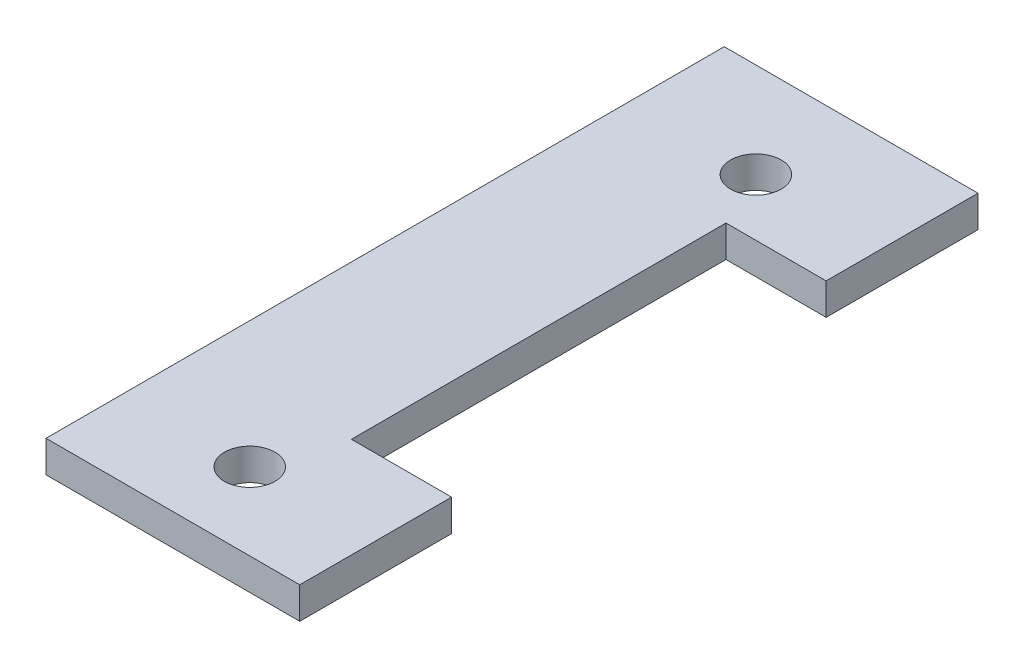
ISO-10303-21;
HEADER;
FILE_DESCRIPTION(('STEP AP214'),'2;1');
FILE_NAME('part.step','',(''),(''),'','','');
FILE_SCHEMA(('AUTOMOTIVE_DESIGN { 1 0 10303 214 1 1 1 1 }'));
ENDSEC;
DATA;
#1=APPLICATION_CONTEXT('core data for automotive mechanical design processes');
#2=APPLICATION_PROTOCOL_DEFINITION('international standard','automotive_design',2000,#1);
#3=PRODUCT_CONTEXT('',#1,'mechanical');
#4=PRODUCT('Part','Part','',(#3));
#5=PRODUCT_RELATED_PRODUCT_CATEGORY('part','',(#4));
#6=PRODUCT_DEFINITION_FORMATION('','',#4);
#7=PRODUCT_DEFINITION_CONTEXT('part definition',#1,'design');
#8=PRODUCT_DEFINITION('design','',#6,#7);
#9=PRODUCT_DEFINITION_SHAPE('','',#8);
#10=(LENGTH_UNIT() NAMED_UNIT(*) SI_UNIT(.MILLI.,.METRE.));
#11=(NAMED_UNIT(*) PLANE_ANGLE_UNIT() SI_UNIT($,.RADIAN.));
#12=(NAMED_UNIT(*) SI_UNIT($,.STERADIAN.) SOLID_ANGLE_UNIT());
#13=UNCERTAINTY_MEASURE_WITH_UNIT(LENGTH_MEASURE(1.E-05),#10,'distance_accuracy_value','');
#14=(GEOMETRIC_REPRESENTATION_CONTEXT(3) GLOBAL_UNCERTAINTY_ASSIGNED_CONTEXT((#13)) GLOBAL_UNIT_ASSIGNED_CONTEXT((#10,
#11,#12)) REPRESENTATION_CONTEXT('',''));
#15=CARTESIAN_POINT('',(0.,0.,0.));
#16=DIRECTION('',(0.,0.,1.));
#17=DIRECTION('',(1.,0.,0.));
#18=AXIS2_PLACEMENT_3D('',#15,#16,#17);
#19=CARTESIAN_POINT('',(4.48871347186386,3.175,88.1367777885566));
#20=DIRECTION('',(1.,0.,0.));
#21=DIRECTION('',(0.,0.,-1.));
#22=AXIS2_PLACEMENT_3D('',#19,#20,#21);
#23=PLANE('',#22);
#24=DIRECTION('',(0.,0.,1.));
#25=VECTOR('',#24,1.);
#26=CARTESIAN_POINT('',(4.48871347186386,0.,88.1367777885566));
#27=LINE('',#26,#25);
#28=CARTESIAN_POINT('',(4.48871347186386,0.,20.0647777885566));
#29=VERTEX_POINT('',#28);
#30=CARTESIAN_POINT('',(4.48871347186386,0.,88.1367777885566));
#31=VERTEX_POINT('',#30);
#32=EDGE_CURVE('E129',#29,#31,#27,.T.);
#33=ORIENTED_EDGE('',*,*,#32,.T.);
#34=DIRECTION('',(0.,-1.,0.));
#35=VECTOR('',#34,1.);
#36=CARTESIAN_POINT('',(4.48871347186386,3.175,88.1367777885566));
#37=LINE('',#36,#35);
#38=CARTESIAN_POINT('',(4.48871347186386,3.175,88.1367777885566));
#39=VERTEX_POINT('',#38);
#40=EDGE_CURVE('E11',#39,#31,#37,.T.);
#41=ORIENTED_EDGE('',*,*,#40,.F.);
#42=DIRECTION('',(0.,0.,1.));
#43=VECTOR('',#42,1.);
#44=CARTESIAN_POINT('',(4.48871347186386,3.175,88.1367777885566));
#45=LINE('',#44,#43);
#46=CARTESIAN_POINT('',(4.48871347186386,3.175,20.0647777885566));
#47=VERTEX_POINT('',#46);
#48=EDGE_CURVE('E144',#47,#39,#45,.T.);
#49=ORIENTED_EDGE('',*,*,#48,.F.);
#50=DIRECTION('',(0.,-1.,0.));
#51=VECTOR('',#50,1.);
#52=CARTESIAN_POINT('',(4.48871347186386,3.175,20.0647777885566));
#53=LINE('',#52,#51);
#54=EDGE_CURVE('E125',#47,#29,#53,.T.);
#55=ORIENTED_EDGE('',*,*,#54,.T.);
#56=EDGE_LOOP('',(#33,#41,#49,#55));
#57=FACE_BOUND('',#56,.T.);
#58=ADVANCED_FACE('F33',(#57),#23,.F.);
#59=CARTESIAN_POINT('',(29.9555203887234,3.175,88.1367777885566));
#60=DIRECTION('',(0.,0.,-1.));
#61=DIRECTION('',(-1.,0.,0.));
#62=AXIS2_PLACEMENT_3D('',#59,#60,#61);
#63=PLANE('',#62);
#64=DIRECTION('',(1.,0.,0.));
#65=VECTOR('',#64,1.);
#66=CARTESIAN_POINT('',(29.9555203887234,0.,88.1367777885566));
#67=LINE('',#66,#65);
#68=CARTESIAN_POINT('',(29.9555203887234,0.,88.1367777885566));
#69=VERTEX_POINT('',#68);
#70=EDGE_CURVE('E132',#31,#69,#67,.T.);
#71=ORIENTED_EDGE('',*,*,#70,.T.);
#72=DIRECTION('',(0.,-1.,0.));
#73=VECTOR('',#72,1.);
#74=CARTESIAN_POINT('',(29.9555203887234,3.175,88.1367777885566));
#75=LINE('',#74,#73);
#76=CARTESIAN_POINT('',(29.9555203887234,3.175,88.1367777885566));
#77=VERTEX_POINT('',#76);
#78=EDGE_CURVE('E41',#77,#69,#75,.T.);
#79=ORIENTED_EDGE('',*,*,#78,.F.);
#80=DIRECTION('',(1.,0.,0.));
#81=VECTOR('',#80,1.);
#82=CARTESIAN_POINT('',(29.9555203887234,3.175,88.1367777885566));
#83=LINE('',#82,#81);
#84=EDGE_CURVE('E92',#39,#77,#83,.T.);
#85=ORIENTED_EDGE('',*,*,#84,.F.);
#86=ORIENTED_EDGE('',*,*,#40,.T.);
#87=EDGE_LOOP('',(#71,#79,#85,#86));
#88=FACE_BOUND('',#87,.T.);
#89=ADVANCED_FACE('F213',(#88),#63,.F.);
#90=CARTESIAN_POINT('',(29.9555203887234,3.175,72.8967777885566));
#91=DIRECTION('',(-1.,0.,0.));
#92=DIRECTION('',(0.,0.,1.));
#93=AXIS2_PLACEMENT_3D('',#90,#91,#92);
#94=PLANE('',#93);
#95=DIRECTION('',(0.,0.,-1.));
#96=VECTOR('',#95,1.);
#97=CARTESIAN_POINT('',(29.9555203887234,0.,72.8967777885566));
#98=LINE('',#97,#96);
#99=CARTESIAN_POINT('',(29.9555203887234,0.,72.8967777885566));
#100=VERTEX_POINT('',#99);
#101=EDGE_CURVE('E135',#69,#100,#98,.T.);
#102=ORIENTED_EDGE('',*,*,#101,.T.);
#103=DIRECTION('',(0.,-1.,0.));
#104=VECTOR('',#103,1.);
#105=CARTESIAN_POINT('',(29.9555203887234,3.175,72.8967777885566));
#106=LINE('',#105,#104);
#107=CARTESIAN_POINT('',(29.9555203887234,3.175,72.8967777885566));
#108=VERTEX_POINT('',#107);
#109=EDGE_CURVE('E151',#108,#100,#106,.T.);
#110=ORIENTED_EDGE('',*,*,#109,.F.);
#111=DIRECTION('',(0.,0.,-1.));
#112=VECTOR('',#111,1.);
#113=CARTESIAN_POINT('',(29.9555203887234,3.175,72.8967777885566));
#114=LINE('',#113,#112);
#115=EDGE_CURVE('E159',#77,#108,#114,.T.);
#116=ORIENTED_EDGE('',*,*,#115,.F.);
#117=ORIENTED_EDGE('',*,*,#78,.T.);
#118=EDGE_LOOP('',(#102,#110,#116,#117));
#119=FACE_BOUND('',#118,.T.);
#120=ADVANCED_FACE('F157',(#119),#94,.F.);
#121=CARTESIAN_POINT('',(19.9029423930899,3.175,72.8967777885566));
#122=DIRECTION('',(0.,0.,1.));
#123=DIRECTION('',(1.,0.,0.));
#124=AXIS2_PLACEMENT_3D('',#121,#122,#123);
#125=PLANE('',#124);
#126=DIRECTION('',(-1.,0.,0.));
#127=VECTOR('',#126,1.);
#128=CARTESIAN_POINT('',(19.9029423930899,0.,72.8967777885566));
#129=LINE('',#128,#127);
#130=CARTESIAN_POINT('',(19.9029423930899,0.,72.8967777885566));
#131=VERTEX_POINT('',#130);
#132=EDGE_CURVE('E137',#100,#131,#129,.T.);
#133=ORIENTED_EDGE('',*,*,#132,.T.);
#134=DIRECTION('',(0.,-1.,0.));
#135=VECTOR('',#134,1.);
#136=CARTESIAN_POINT('',(19.9029423930899,3.175,72.8967777885566));
#137=LINE('',#136,#135);
#138=CARTESIAN_POINT('',(19.9029423930899,3.175,72.8967777885566));
#139=VERTEX_POINT('',#138);
#140=EDGE_CURVE('E148',#139,#131,#137,.T.);
#141=ORIENTED_EDGE('',*,*,#140,.F.);
#142=DIRECTION('',(-1.,0.,0.));
#143=VECTOR('',#142,1.);
#144=CARTESIAN_POINT('',(19.9029423930899,3.175,72.8967777885566));
#145=LINE('',#144,#143);
#146=EDGE_CURVE('E171',#108,#139,#145,.T.);
#147=ORIENTED_EDGE('',*,*,#146,.F.);
#148=ORIENTED_EDGE('',*,*,#109,.T.);
#149=EDGE_LOOP('',(#133,#141,#147,#148));
#150=FACE_BOUND('',#149,.T.);
#151=ADVANCED_FACE('F167',(#150),#125,.F.);
#152=CARTESIAN_POINT('',(19.9029423930899,3.175,35.3047777885566));
#153=DIRECTION('',(-1.,0.,0.));
#154=DIRECTION('',(0.,0.,1.));
#155=AXIS2_PLACEMENT_3D('',#152,#153,#154);
#156=PLANE('',#155);
#157=DIRECTION('',(0.,0.,-1.));
#158=VECTOR('',#157,1.);
#159=CARTESIAN_POINT('',(19.9029423930899,0.,35.3047777885566));
#160=LINE('',#159,#158);
#161=CARTESIAN_POINT('',(19.9029423930899,0.,35.3047777885566));
#162=VERTEX_POINT('',#161);
#163=EDGE_CURVE('E139',#131,#162,#160,.T.);
#164=ORIENTED_EDGE('',*,*,#163,.T.);
#165=DIRECTION('',(0.,-1.,0.));
#166=VECTOR('',#165,1.);
#167=CARTESIAN_POINT('',(19.9029423930899,3.175,35.3047777885566));
#168=LINE('',#167,#166);
#169=CARTESIAN_POINT('',(19.9029423930899,3.175,35.3047777885566));
#170=VERTEX_POINT('',#169);
#171=EDGE_CURVE('E120',#170,#162,#168,.T.);
#172=ORIENTED_EDGE('',*,*,#171,.F.);
#173=DIRECTION('',(0.,0.,-1.));
#174=VECTOR('',#173,1.);
#175=CARTESIAN_POINT('',(19.9029423930899,3.175,35.3047777885566));
#176=LINE('',#175,#174);
#177=EDGE_CURVE('E111',#139,#170,#176,.T.);
#178=ORIENTED_EDGE('',*,*,#177,.F.);
#179=ORIENTED_EDGE('',*,*,#140,.T.);
#180=EDGE_LOOP('',(#164,#172,#178,#179));
#181=FACE_BOUND('',#180,.T.);
#182=ADVANCED_FACE('F170',(#181),#156,.F.);
#183=CARTESIAN_POINT('',(29.9555203887234,3.175,35.3047777885566));
#184=DIRECTION('',(0.,0.,-1.));
#185=DIRECTION('',(-1.,0.,0.));
#186=AXIS2_PLACEMENT_3D('',#183,#184,#185);
#187=PLANE('',#186);
#188=DIRECTION('',(1.,0.,0.));
#189=VECTOR('',#188,1.);
#190=CARTESIAN_POINT('',(29.9555203887234,0.,35.3047777885566));
#191=LINE('',#190,#189);
#192=CARTESIAN_POINT('',(29.9555203887234,0.,35.3047777885566));
#193=VERTEX_POINT('',#192);
#194=EDGE_CURVE('E119',#162,#193,#191,.T.);
#195=ORIENTED_EDGE('',*,*,#194,.T.);
#196=DIRECTION('',(0.,-1.,0.));
#197=VECTOR('',#196,1.);
#198=CARTESIAN_POINT('',(29.9555203887234,3.175,35.3047777885566));
#199=LINE('',#198,#197);
#200=CARTESIAN_POINT('',(29.9555203887234,3.175,35.3047777885566));
#201=VERTEX_POINT('',#200);
#202=EDGE_CURVE('E116',#201,#193,#199,.T.);
#203=ORIENTED_EDGE('',*,*,#202,.F.);
#204=DIRECTION('',(1.,0.,0.));
#205=VECTOR('',#204,1.);
#206=CARTESIAN_POINT('',(29.9555203887234,3.175,35.3047777885566));
#207=LINE('',#206,#205);
#208=EDGE_CURVE('E105',#170,#201,#207,.T.);
#209=ORIENTED_EDGE('',*,*,#208,.F.);
#210=ORIENTED_EDGE('',*,*,#171,.T.);
#211=EDGE_LOOP('',(#195,#203,#209,#210));
#212=FACE_BOUND('',#211,.T.);
#213=ADVANCED_FACE('F117',(#212),#187,.F.);
#214=CARTESIAN_POINT('',(29.9555203887234,3.175,20.0647777885566));
#215=DIRECTION('',(-1.,0.,0.));
#216=DIRECTION('',(0.,0.,1.));
#217=AXIS2_PLACEMENT_3D('',#214,#215,#216);
#218=PLANE('',#217);
#219=DIRECTION('',(0.,0.,-1.));
#220=VECTOR('',#219,1.);
#221=CARTESIAN_POINT('',(29.9555203887234,0.,20.0647777885566));
#222=LINE('',#221,#220);
#223=CARTESIAN_POINT('',(29.9555203887234,0.,20.0647777885566));
#224=VERTEX_POINT('',#223);
#225=EDGE_CURVE('E78',#193,#224,#222,.T.);
#226=ORIENTED_EDGE('',*,*,#225,.T.);
#227=DIRECTION('',(0.,-1.,0.));
#228=VECTOR('',#227,1.);
#229=CARTESIAN_POINT('',(29.9555203887234,3.175,20.0647777885566));
#230=LINE('',#229,#228);
#231=CARTESIAN_POINT('',(29.9555203887234,3.175,20.0647777885566));
#232=VERTEX_POINT('',#231);
#233=EDGE_CURVE('E121',#232,#224,#230,.T.);
#234=ORIENTED_EDGE('',*,*,#233,.F.);
#235=DIRECTION('',(0.,0.,-1.));
#236=VECTOR('',#235,1.);
#237=CARTESIAN_POINT('',(29.9555203887234,3.175,20.0647777885566));
#238=LINE('',#237,#236);
#239=EDGE_CURVE('E109',#201,#232,#238,.T.);
#240=ORIENTED_EDGE('',*,*,#239,.F.);
#241=ORIENTED_EDGE('',*,*,#202,.T.);
#242=EDGE_LOOP('',(#226,#234,#240,#241));
#243=FACE_BOUND('',#242,.T.);
#244=ADVANCED_FACE('F123',(#243),#218,.F.);
#245=CARTESIAN_POINT('',(4.48871347186386,3.175,20.0647777885566));
#246=DIRECTION('',(0.,0.,1.));
#247=DIRECTION('',(1.,0.,0.));
#248=AXIS2_PLACEMENT_3D('',#245,#246,#247);
#249=PLANE('',#248);
#250=DIRECTION('',(-1.,0.,0.));
#251=VECTOR('',#250,1.);
#252=CARTESIAN_POINT('',(4.48871347186386,0.,20.0647777885566));
#253=LINE('',#252,#251);
#254=EDGE_CURVE('E84',#224,#29,#253,.T.);
#255=ORIENTED_EDGE('',*,*,#254,.T.);
#256=ORIENTED_EDGE('',*,*,#54,.F.);
#257=DIRECTION('',(-1.,0.,0.));
#258=VECTOR('',#257,1.);
#259=CARTESIAN_POINT('',(4.48871347186386,3.175,20.0647777885566));
#260=LINE('',#259,#258);
#261=EDGE_CURVE('E49',#232,#47,#260,.T.);
#262=ORIENTED_EDGE('',*,*,#261,.F.);
#263=ORIENTED_EDGE('',*,*,#233,.T.);
#264=EDGE_LOOP('',(#255,#256,#262,#263));
#265=FACE_BOUND('',#264,.T.);
#266=ADVANCED_FACE('F200',(#265),#249,.F.);
#267=CARTESIAN_POINT('',(0.,3.175,0.));
#268=DIRECTION('',(0.,-1.,0.));
#269=DIRECTION('',(0.,0.,-1.));
#270=AXIS2_PLACEMENT_3D('',#267,#268,#269);
#271=PLANE('',#270);
#272=CARTESIAN_POINT('',(17.1887134718639,3.175,29.5897777885566));
#273=DIRECTION('',(0.,1.,0.));
#274=DIRECTION('',(0.,0.,1.));
#275=AXIS2_PLACEMENT_3D('',#272,#273,#274);
#276=CIRCLE('',#275,2.54);
#277=CARTESIAN_POINT('',(17.1887134718639,3.175,32.1297777885566));
#278=VERTEX_POINT('',#277);
#279=EDGE_CURVE('E183',#278,#278,#276,.T.);
#280=ORIENTED_EDGE('',*,*,#279,.F.);
#281=EDGE_LOOP('',(#280));
#282=FACE_BOUND('',#281,.T.);
#283=CARTESIAN_POINT('',(17.1887134718639,3.175,80.3897777885566));
#284=DIRECTION('',(0.,1.,0.));
#285=DIRECTION('',(0.,0.,1.));
#286=AXIS2_PLACEMENT_3D('',#283,#284,#285);
#287=CIRCLE('',#286,2.54);
#288=CARTESIAN_POINT('',(17.1887134718639,3.175,82.9297777885566));
#289=VERTEX_POINT('',#288);
#290=EDGE_CURVE('E177',#289,#289,#287,.T.);
#291=ORIENTED_EDGE('',*,*,#290,.F.);
#292=EDGE_LOOP('',(#291));
#293=FACE_BOUND('',#292,.T.);
#294=ORIENTED_EDGE('',*,*,#48,.T.);
#295=ORIENTED_EDGE('',*,*,#84,.T.);
#296=ORIENTED_EDGE('',*,*,#115,.T.);
#297=ORIENTED_EDGE('',*,*,#146,.T.);
#298=ORIENTED_EDGE('',*,*,#177,.T.);
#299=ORIENTED_EDGE('',*,*,#208,.T.);
#300=ORIENTED_EDGE('',*,*,#239,.T.);
#301=ORIENTED_EDGE('',*,*,#261,.T.);
#302=EDGE_LOOP('',(#294,#295,#296,#297,#298,#299,#300,#301));
#303=FACE_BOUND('',#302,.T.);
#304=ADVANCED_FACE('F107',(#282,#293,#303),#271,.F.);
#305=CARTESIAN_POINT('',(0.,0.,0.));
#306=DIRECTION('',(0.,-1.,0.));
#307=DIRECTION('',(0.,0.,-1.));
#308=AXIS2_PLACEMENT_3D('',#305,#306,#307);
#309=PLANE('',#308);
#310=CARTESIAN_POINT('',(17.1887134718639,0.,29.5897777885566));
#311=DIRECTION('',(0.,1.,0.));
#312=DIRECTION('',(0.,0.,1.));
#313=AXIS2_PLACEMENT_3D('',#310,#311,#312);
#314=CIRCLE('',#313,2.54);
#315=CARTESIAN_POINT('',(17.1887134718639,0.,32.1297777885566));
#316=VERTEX_POINT('',#315);
#317=EDGE_CURVE('E133',#316,#316,#314,.T.);
#318=ORIENTED_EDGE('',*,*,#317,.T.);
#319=EDGE_LOOP('',(#318));
#320=FACE_BOUND('',#319,.T.);
#321=CARTESIAN_POINT('',(17.1887134718639,0.,80.3897777885566));
#322=DIRECTION('',(0.,1.,0.));
#323=DIRECTION('',(0.,0.,1.));
#324=AXIS2_PLACEMENT_3D('',#321,#322,#323);
#325=CIRCLE('',#324,2.54);
#326=CARTESIAN_POINT('',(17.1887134718639,0.,82.9297777885566));
#327=VERTEX_POINT('',#326);
#328=EDGE_CURVE('E180',#327,#327,#325,.T.);
#329=ORIENTED_EDGE('',*,*,#328,.T.);
#330=EDGE_LOOP('',(#329));
#331=FACE_BOUND('',#330,.T.);
#332=ORIENTED_EDGE('',*,*,#32,.F.);
#333=ORIENTED_EDGE('',*,*,#254,.F.);
#334=ORIENTED_EDGE('',*,*,#225,.F.);
#335=ORIENTED_EDGE('',*,*,#194,.F.);
#336=ORIENTED_EDGE('',*,*,#163,.F.);
#337=ORIENTED_EDGE('',*,*,#132,.F.);
#338=ORIENTED_EDGE('',*,*,#101,.F.);
#339=ORIENTED_EDGE('',*,*,#70,.F.);
#340=EDGE_LOOP('',(#332,#333,#334,#335,#336,#337,#338,#339));
#341=FACE_BOUND('',#340,.T.);
#342=ADVANCED_FACE('F163',(#320,#331,#341),#309,.T.);
#343=CARTESIAN_POINT('',(17.1887134718639,0.,80.3897777885566));
#344=DIRECTION('',(0.,1.,0.));
#345=DIRECTION('',(0.,0.,1.));
#346=AXIS2_PLACEMENT_3D('',#343,#344,#345);
#347=CYLINDRICAL_SURFACE('',#346,2.54);
#348=ORIENTED_EDGE('',*,*,#328,.F.);
#349=EDGE_LOOP('',(#348));
#350=FACE_BOUND('',#349,.T.);
#351=ORIENTED_EDGE('',*,*,#290,.T.);
#352=EDGE_LOOP('',(#351));
#353=FACE_BOUND('',#352,.T.);
#354=ADVANCED_FACE('F194',(#350,#353),#347,.F.);
#355=CARTESIAN_POINT('',(17.1887134718639,0.,29.5897777885566));
#356=DIRECTION('',(0.,1.,0.));
#357=DIRECTION('',(0.,0.,1.));
#358=AXIS2_PLACEMENT_3D('',#355,#356,#357);
#359=CYLINDRICAL_SURFACE('',#358,2.54);
#360=ORIENTED_EDGE('',*,*,#317,.F.);
#361=EDGE_LOOP('',(#360));
#362=FACE_BOUND('',#361,.T.);
#363=ORIENTED_EDGE('',*,*,#279,.T.);
#364=EDGE_LOOP('',(#363));
#365=FACE_BOUND('',#364,.T.);
#366=ADVANCED_FACE('F191',(#362,#365),#359,.F.);
#367=CLOSED_SHELL('',(#58,#89,#120,#151,#182,#213,#244,#266,#304,#342,#354,#366));
#368=MANIFOLD_SOLID_BREP('B2',#367);
#369=ADVANCED_BREP_SHAPE_REPRESENTATION('',(#18,#368),#14);
#370=SHAPE_DEFINITION_REPRESENTATION(#9,#369);
ENDSEC;
END-ISO-10303-21;
